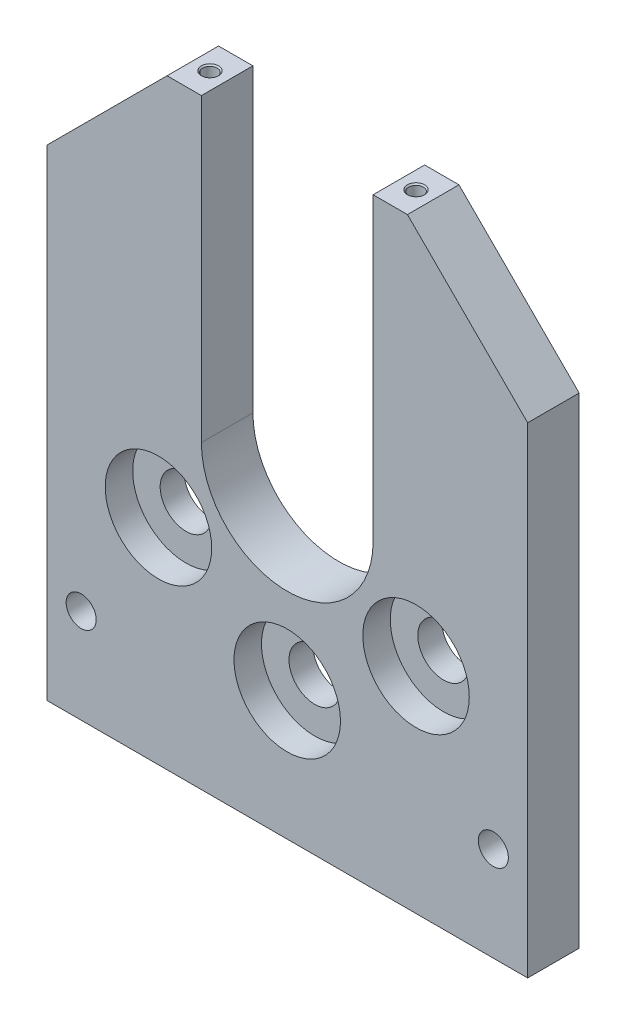
ISO-10303-21;
HEADER;
FILE_DESCRIPTION(('STEP AP214'),'2;1');
FILE_NAME('part.step','',(''),(''),'','','');
FILE_SCHEMA(('AUTOMOTIVE_DESIGN { 1 0 10303 214 1 1 1 1 }'));
ENDSEC;
DATA;
#1=APPLICATION_CONTEXT('core data for automotive mechanical design processes');
#2=APPLICATION_PROTOCOL_DEFINITION('international standard','automotive_design',2000,#1);
#3=PRODUCT_CONTEXT('',#1,'mechanical');
#4=PRODUCT('Part','Part','',(#3));
#5=PRODUCT_RELATED_PRODUCT_CATEGORY('part','',(#4));
#6=PRODUCT_DEFINITION_FORMATION('','',#4);
#7=PRODUCT_DEFINITION_CONTEXT('part definition',#1,'design');
#8=PRODUCT_DEFINITION('design','',#6,#7);
#9=PRODUCT_DEFINITION_SHAPE('','',#8);
#10=(LENGTH_UNIT() NAMED_UNIT(*) SI_UNIT(.MILLI.,.METRE.));
#11=(NAMED_UNIT(*) PLANE_ANGLE_UNIT() SI_UNIT($,.RADIAN.));
#12=(NAMED_UNIT(*) SI_UNIT($,.STERADIAN.) SOLID_ANGLE_UNIT());
#13=UNCERTAINTY_MEASURE_WITH_UNIT(LENGTH_MEASURE(1.E-05),#10,'distance_accuracy_value','');
#14=(GEOMETRIC_REPRESENTATION_CONTEXT(3) GLOBAL_UNCERTAINTY_ASSIGNED_CONTEXT((#13)) GLOBAL_UNIT_ASSIGNED_CONTEXT((#10,
#11,#12)) REPRESENTATION_CONTEXT('',''));
#15=CARTESIAN_POINT('',(0.,0.,0.));
#16=DIRECTION('',(0.,0.,1.));
#17=DIRECTION('',(1.,0.,0.));
#18=AXIS2_PLACEMENT_3D('',#15,#16,#17);
#19=CARTESIAN_POINT('',(0.,75.,-335.));
#20=DIRECTION('',(0.,0.,1.));
#21=DIRECTION('',(1.,0.,0.));
#22=AXIS2_PLACEMENT_3D('',#19,#20,#21);
#23=CYLINDRICAL_SURFACE('',#22,15.);
#24=CARTESIAN_POINT('',(0.,75.,-15.));
#25=DIRECTION('',(0.,0.,1.));
#26=DIRECTION('',(1.,0.,0.));
#27=AXIS2_PLACEMENT_3D('',#24,#25,#26);
#28=CIRCLE('',#27,15.);
#29=CARTESIAN_POINT('',(15.,75.,-15.));
#30=VERTEX_POINT('',#29);
#31=EDGE_CURVE('E228',#30,#30,#28,.T.);
#32=ORIENTED_EDGE('',*,*,#31,.F.);
#33=EDGE_LOOP('',(#32));
#34=FACE_BOUND('',#33,.T.);
#35=CARTESIAN_POINT('',(0.,75.,-1.));
#36=DIRECTION('',(0.,0.,1.));
#37=DIRECTION('',(1.,0.,0.));
#38=AXIS2_PLACEMENT_3D('',#35,#36,#37);
#39=CIRCLE('',#38,15.);
#40=CARTESIAN_POINT('',(15.,75.,-1.));
#41=VERTEX_POINT('',#40);
#42=EDGE_CURVE('E50',#41,#41,#39,.F.);
#43=ORIENTED_EDGE('',*,*,#42,.F.);
#44=EDGE_LOOP('',(#43));
#45=FACE_BOUND('',#44,.T.);
#46=ADVANCED_FACE('F45',(#34,#45),#23,.F.);
#47=CARTESIAN_POINT('',(75.,124.749371855331,-335.));
#48=DIRECTION('',(0.,0.,1.));
#49=DIRECTION('',(1.,0.,0.));
#50=AXIS2_PLACEMENT_3D('',#47,#48,#49);
#51=CYLINDRICAL_SURFACE('',#50,15.);
#52=CARTESIAN_POINT('',(75.,124.749371855331,-15.));
#53=DIRECTION('',(0.,0.,1.));
#54=DIRECTION('',(1.,0.,0.));
#55=AXIS2_PLACEMENT_3D('',#52,#53,#54);
#56=CIRCLE('',#55,15.);
#57=CARTESIAN_POINT('',(90.,124.749371855331,-15.));
#58=VERTEX_POINT('',#57);
#59=EDGE_CURVE('E232',#58,#58,#56,.T.);
#60=ORIENTED_EDGE('',*,*,#59,.F.);
#61=EDGE_LOOP('',(#60));
#62=FACE_BOUND('',#61,.T.);
#63=CARTESIAN_POINT('',(75.,124.749371855331,-1.));
#64=DIRECTION('',(0.,0.,1.));
#65=DIRECTION('',(1.,0.,0.));
#66=AXIS2_PLACEMENT_3D('',#63,#64,#65);
#67=CIRCLE('',#66,15.);
#68=CARTESIAN_POINT('',(90.,124.749371855331,-1.));
#69=VERTEX_POINT('',#68);
#70=EDGE_CURVE('E222',#69,#69,#67,.F.);
#71=ORIENTED_EDGE('',*,*,#70,.F.);
#72=EDGE_LOOP('',(#71));
#73=FACE_BOUND('',#72,.T.);
#74=ADVANCED_FACE('F315',(#62,#73),#51,.F.);
#75=CARTESIAN_POINT('',(-75.,124.749371855331,-335.));
#76=DIRECTION('',(0.,0.,1.));
#77=DIRECTION('',(1.,0.,0.));
#78=AXIS2_PLACEMENT_3D('',#75,#76,#77);
#79=CYLINDRICAL_SURFACE('',#78,15.);
#80=CARTESIAN_POINT('',(-75.,124.749371855331,-15.));
#81=DIRECTION('',(0.,0.,1.));
#82=DIRECTION('',(1.,0.,0.));
#83=AXIS2_PLACEMENT_3D('',#80,#81,#82);
#84=CIRCLE('',#83,15.);
#85=CARTESIAN_POINT('',(-60.,124.749371855331,-15.));
#86=VERTEX_POINT('',#85);
#87=EDGE_CURVE('E237',#86,#86,#84,.T.);
#88=ORIENTED_EDGE('',*,*,#87,.F.);
#89=EDGE_LOOP('',(#88));
#90=FACE_BOUND('',#89,.T.);
#91=CARTESIAN_POINT('',(-75.,124.749371855331,-1.));
#92=DIRECTION('',(0.,0.,1.));
#93=DIRECTION('',(1.,0.,0.));
#94=AXIS2_PLACEMENT_3D('',#91,#92,#93);
#95=CIRCLE('',#94,15.);
#96=CARTESIAN_POINT('',(-60.,124.749371855331,-1.));
#97=VERTEX_POINT('',#96);
#98=EDGE_CURVE('E220',#97,#97,#95,.F.);
#99=ORIENTED_EDGE('',*,*,#98,.F.);
#100=EDGE_LOOP('',(#99));
#101=FACE_BOUND('',#100,.T.);
#102=ADVANCED_FACE('F321',(#90,#101),#79,.F.);
#103=CARTESIAN_POINT('',(0.,350.,0.));
#104=DIRECTION('',(0.,1.,0.));
#105=DIRECTION('',(0.,0.,1.));
#106=AXIS2_PLACEMENT_3D('',#103,#104,#105);
#107=PLANE('',#106);
#108=CARTESIAN_POINT('',(60.,350.,0.));
#109=DIRECTION('',(0.,1.,0.));
#110=DIRECTION('',(0.,0.,1.));
#111=AXIS2_PLACEMENT_3D('',#108,#109,#110);
#112=CIRCLE('',#111,5.025);
#113=CARTESIAN_POINT('',(60.,350.,5.025));
#114=VERTEX_POINT('',#113);
#115=EDGE_CURVE('E138',#114,#114,#112,.T.);
#116=ORIENTED_EDGE('',*,*,#115,.F.);
#117=EDGE_LOOP('',(#116));
#118=FACE_BOUND('',#117,.T.);
#119=DIRECTION('',(1.,0.,0.));
#120=VECTOR('',#119,1.);
#121=CARTESIAN_POINT('',(-140.,350.,15.));
#122=LINE('',#121,#120);
#123=CARTESIAN_POINT('',(50.,350.,15.));
#124=VERTEX_POINT('',#123);
#125=CARTESIAN_POINT('',(70.,350.,15.));
#126=VERTEX_POINT('',#125);
#127=EDGE_CURVE('E178',#124,#126,#122,.T.);
#128=ORIENTED_EDGE('',*,*,#127,.T.);
#129=DIRECTION('',(0.,0.,-1.));
#130=VECTOR('',#129,1.);
#131=CARTESIAN_POINT('',(70.,350.,-15.));
#132=LINE('',#131,#130);
#133=CARTESIAN_POINT('',(70.,350.,-15.));
#134=VERTEX_POINT('',#133);
#135=EDGE_CURVE('E55',#126,#134,#132,.T.);
#136=ORIENTED_EDGE('',*,*,#135,.T.);
#137=DIRECTION('',(-1.,0.,0.));
#138=VECTOR('',#137,1.);
#139=CARTESIAN_POINT('',(-140.,350.,-15.));
#140=LINE('',#139,#138);
#141=CARTESIAN_POINT('',(50.,350.,-15.));
#142=VERTEX_POINT('',#141);
#143=EDGE_CURVE('E176',#134,#142,#140,.T.);
#144=ORIENTED_EDGE('',*,*,#143,.T.);
#145=DIRECTION('',(0.,0.,-1.));
#146=VECTOR('',#145,1.);
#147=CARTESIAN_POINT('',(50.,350.,0.));
#148=LINE('',#147,#146);
#149=EDGE_CURVE('E204',#124,#142,#148,.T.);
#150=ORIENTED_EDGE('',*,*,#149,.F.);
#151=EDGE_LOOP('',(#128,#136,#144,#150));
#152=FACE_BOUND('',#151,.T.);
#153=ADVANCED_FACE('F267',(#118,#152),#107,.T.);
#154=CARTESIAN_POINT('',(140.,350.,-15.));
#155=DIRECTION('',(-1.,0.,0.));
#156=DIRECTION('',(0.,0.,1.));
#157=AXIS2_PLACEMENT_3D('',#154,#155,#156);
#158=PLANE('',#157);
#159=DIRECTION('',(0.,-1.,0.));
#160=VECTOR('',#159,1.);
#161=CARTESIAN_POINT('',(140.,350.,-15.));
#162=LINE('',#161,#160);
#163=CARTESIAN_POINT('',(140.,280.,-15.));
#164=VERTEX_POINT('',#163);
#165=CARTESIAN_POINT('',(140.,0.,-15.));
#166=VERTEX_POINT('',#165);
#167=EDGE_CURVE('E199',#164,#166,#162,.T.);
#168=ORIENTED_EDGE('',*,*,#167,.F.);
#169=DIRECTION('',(0.,0.,1.));
#170=VECTOR('',#169,1.);
#171=CARTESIAN_POINT('',(140.,280.,15.));
#172=LINE('',#171,#170);
#173=CARTESIAN_POINT('',(140.,280.,15.));
#174=VERTEX_POINT('',#173);
#175=EDGE_CURVE('E11',#164,#174,#172,.T.);
#176=ORIENTED_EDGE('',*,*,#175,.T.);
#177=DIRECTION('',(0.,-1.,0.));
#178=VECTOR('',#177,1.);
#179=CARTESIAN_POINT('',(140.,350.,15.));
#180=LINE('',#179,#178);
#181=CARTESIAN_POINT('',(140.,0.,15.));
#182=VERTEX_POINT('',#181);
#183=EDGE_CURVE('E182',#174,#182,#180,.T.);
#184=ORIENTED_EDGE('',*,*,#183,.T.);
#185=DIRECTION('',(0.,0.,-1.));
#186=VECTOR('',#185,1.);
#187=CARTESIAN_POINT('',(140.,0.,-15.));
#188=LINE('',#187,#186);
#189=EDGE_CURVE('E175',#182,#166,#188,.T.);
#190=ORIENTED_EDGE('',*,*,#189,.T.);
#191=EDGE_LOOP('',(#168,#176,#184,#190));
#192=FACE_BOUND('',#191,.T.);
#193=ADVANCED_FACE('F366',(#192),#158,.F.);
#194=CARTESIAN_POINT('',(-140.,350.,-15.));
#195=DIRECTION('',(0.,0.,1.));
#196=DIRECTION('',(1.,0.,0.));
#197=AXIS2_PLACEMENT_3D('',#194,#195,#196);
#198=PLANE('',#197);
#199=ORIENTED_EDGE('',*,*,#87,.T.);
#200=EDGE_LOOP('',(#199));
#201=FACE_BOUND('',#200,.T.);
#202=ORIENTED_EDGE('',*,*,#59,.T.);
#203=EDGE_LOOP('',(#202));
#204=FACE_BOUND('',#203,.T.);
#205=ORIENTED_EDGE('',*,*,#31,.T.);
#206=EDGE_LOOP('',(#205));
#207=FACE_BOUND('',#206,.T.);
#208=CARTESIAN_POINT('',(-120.,55.,-15.));
#209=DIRECTION('',(0.,0.,1.));
#210=DIRECTION('',(1.,0.,0.));
#211=AXIS2_PLACEMENT_3D('',#208,#209,#210);
#212=CIRCLE('',#211,8.75000000000001);
#213=CARTESIAN_POINT('',(-111.25,55.,-15.));
#214=VERTEX_POINT('',#213);
#215=EDGE_CURVE('E254',#214,#214,#212,.T.);
#216=ORIENTED_EDGE('',*,*,#215,.T.);
#217=EDGE_LOOP('',(#216));
#218=FACE_BOUND('',#217,.T.);
#219=CARTESIAN_POINT('',(120.,55.,-15.));
#220=DIRECTION('',(0.,0.,1.));
#221=DIRECTION('',(1.,0.,0.));
#222=AXIS2_PLACEMENT_3D('',#219,#220,#221);
#223=CIRCLE('',#222,8.75);
#224=CARTESIAN_POINT('',(128.75,55.,-15.));
#225=VERTEX_POINT('',#224);
#226=EDGE_CURVE('E249',#225,#225,#223,.T.);
#227=ORIENTED_EDGE('',*,*,#226,.T.);
#228=EDGE_LOOP('',(#227));
#229=FACE_BOUND('',#228,.T.);
#230=DIRECTION('',(0.,-1.,0.));
#231=VECTOR('',#230,1.);
#232=CARTESIAN_POINT('',(-140.,350.,-15.));
#233=LINE('',#232,#231);
#234=CARTESIAN_POINT('',(-140.,280.,-15.));
#235=VERTEX_POINT('',#234);
#236=CARTESIAN_POINT('',(-140.,0.,-15.));
#237=VERTEX_POINT('',#236);
#238=EDGE_CURVE('E197',#235,#237,#233,.T.);
#239=ORIENTED_EDGE('',*,*,#238,.F.);
#240=DIRECTION('',(0.707106781186546,0.707106781186549,0.));
#241=VECTOR('',#240,1.);
#242=CARTESIAN_POINT('',(-70.0000000000001,350.,-15.));
#243=LINE('',#242,#241);
#244=CARTESIAN_POINT('',(-70.0000000000001,350.,-15.));
#245=VERTEX_POINT('',#244);
#246=EDGE_CURVE('E217',#235,#245,#243,.T.);
#247=ORIENTED_EDGE('',*,*,#246,.T.);
#248=CARTESIAN_POINT('',(-50.,350.,-15.));
#249=VERTEX_POINT('',#248);
#250=EDGE_CURVE('E179',#249,#245,#140,.T.);
#251=ORIENTED_EDGE('',*,*,#250,.F.);
#252=DIRECTION('',(0.,-1.,0.));
#253=VECTOR('',#252,1.);
#254=CARTESIAN_POINT('',(-50.,350.,-15.));
#255=LINE('',#254,#253);
#256=CARTESIAN_POINT('',(-50.,175.,-15.));
#257=VERTEX_POINT('',#256);
#258=EDGE_CURVE('E165',#249,#257,#255,.T.);
#259=ORIENTED_EDGE('',*,*,#258,.T.);
#260=CARTESIAN_POINT('',(0.,175.,-15.));
#261=DIRECTION('',(0.,0.,1.));
#262=DIRECTION('',(1.,0.,0.));
#263=AXIS2_PLACEMENT_3D('',#260,#261,#262);
#264=CIRCLE('',#263,50.);
#265=CARTESIAN_POINT('',(50.,175.,-15.));
#266=VERTEX_POINT('',#265);
#267=EDGE_CURVE('E172',#257,#266,#264,.T.);
#268=ORIENTED_EDGE('',*,*,#267,.T.);
#269=DIRECTION('',(0.,1.,0.));
#270=VECTOR('',#269,1.);
#271=CARTESIAN_POINT('',(50.,350.,-15.));
#272=LINE('',#271,#270);
#273=EDGE_CURVE('E169',#266,#142,#272,.T.);
#274=ORIENTED_EDGE('',*,*,#273,.T.);
#275=ORIENTED_EDGE('',*,*,#143,.F.);
#276=DIRECTION('',(0.707106781186546,-0.707106781186549,0.));
#277=VECTOR('',#276,1.);
#278=CARTESIAN_POINT('',(70.,350.,-15.));
#279=LINE('',#278,#277);
#280=EDGE_CURVE('E63',#134,#164,#279,.T.);
#281=ORIENTED_EDGE('',*,*,#280,.T.);
#282=ORIENTED_EDGE('',*,*,#167,.T.);
#283=DIRECTION('',(-1.,0.,0.));
#284=VECTOR('',#283,1.);
#285=CARTESIAN_POINT('',(-140.,0.,-15.));
#286=LINE('',#285,#284);
#287=EDGE_CURVE('E185',#166,#237,#286,.T.);
#288=ORIENTED_EDGE('',*,*,#287,.T.);
#289=EDGE_LOOP('',(#239,#247,#251,#259,#268,#274,#275,#281,#282,#288));
#290=FACE_BOUND('',#289,.T.);
#291=ADVANCED_FACE('F295',(#201,#204,#207,#218,#229,#290),#198,.F.);
#292=CARTESIAN_POINT('',(-140.,350.,-15.));
#293=DIRECTION('',(1.,0.,0.));
#294=DIRECTION('',(0.,0.,-1.));
#295=AXIS2_PLACEMENT_3D('',#292,#293,#294);
#296=PLANE('',#295);
#297=DIRECTION('',(0.,-1.,0.));
#298=VECTOR('',#297,1.);
#299=CARTESIAN_POINT('',(-140.,350.,15.));
#300=LINE('',#299,#298);
#301=CARTESIAN_POINT('',(-140.,280.,15.));
#302=VERTEX_POINT('',#301);
#303=CARTESIAN_POINT('',(-140.,0.,15.));
#304=VERTEX_POINT('',#303);
#305=EDGE_CURVE('E195',#302,#304,#300,.T.);
#306=ORIENTED_EDGE('',*,*,#305,.F.);
#307=DIRECTION('',(0.,0.,-1.));
#308=VECTOR('',#307,1.);
#309=CARTESIAN_POINT('',(-140.,280.,-15.));
#310=LINE('',#309,#308);
#311=EDGE_CURVE('E214',#302,#235,#310,.T.);
#312=ORIENTED_EDGE('',*,*,#311,.T.);
#313=ORIENTED_EDGE('',*,*,#238,.T.);
#314=DIRECTION('',(0.,0.,1.));
#315=VECTOR('',#314,1.);
#316=CARTESIAN_POINT('',(-140.,0.,-15.));
#317=LINE('',#316,#315);
#318=EDGE_CURVE('E188',#237,#304,#317,.T.);
#319=ORIENTED_EDGE('',*,*,#318,.T.);
#320=EDGE_LOOP('',(#306,#312,#313,#319));
#321=FACE_BOUND('',#320,.T.);
#322=ADVANCED_FACE('F281',(#321),#296,.F.);
#323=CARTESIAN_POINT('',(-140.,350.,15.));
#324=DIRECTION('',(0.,0.,-1.));
#325=DIRECTION('',(-1.,0.,0.));
#326=AXIS2_PLACEMENT_3D('',#323,#324,#325);
#327=PLANE('',#326);
#328=CARTESIAN_POINT('',(-75.,124.749371855331,15.));
#329=DIRECTION('',(0.,0.,1.));
#330=DIRECTION('',(1.,0.,0.));
#331=AXIS2_PLACEMENT_3D('',#328,#329,#330);
#332=CIRCLE('',#331,31.);
#333=CARTESIAN_POINT('',(-44.,124.749371855331,15.));
#334=VERTEX_POINT('',#333);
#335=EDGE_CURVE('E417',#334,#334,#332,.T.);
#336=ORIENTED_EDGE('',*,*,#335,.F.);
#337=EDGE_LOOP('',(#336));
#338=FACE_BOUND('',#337,.T.);
#339=CARTESIAN_POINT('',(0.,75.,15.));
#340=DIRECTION('',(0.,0.,1.));
#341=DIRECTION('',(1.,0.,0.));
#342=AXIS2_PLACEMENT_3D('',#339,#340,#341);
#343=CIRCLE('',#342,31.);
#344=CARTESIAN_POINT('',(31.,75.,15.));
#345=VERTEX_POINT('',#344);
#346=EDGE_CURVE('E420',#345,#345,#343,.T.);
#347=ORIENTED_EDGE('',*,*,#346,.F.);
#348=EDGE_LOOP('',(#347));
#349=FACE_BOUND('',#348,.T.);
#350=CARTESIAN_POINT('',(75.,124.749371855331,15.));
#351=DIRECTION('',(0.,0.,1.));
#352=DIRECTION('',(1.,0.,0.));
#353=AXIS2_PLACEMENT_3D('',#350,#351,#352);
#354=CIRCLE('',#353,31.);
#355=CARTESIAN_POINT('',(106.,124.749371855331,15.));
#356=VERTEX_POINT('',#355);
#357=EDGE_CURVE('E427',#356,#356,#354,.T.);
#358=ORIENTED_EDGE('',*,*,#357,.F.);
#359=EDGE_LOOP('',(#358));
#360=FACE_BOUND('',#359,.T.);
#361=CARTESIAN_POINT('',(-120.,55.,15.));
#362=DIRECTION('',(0.,0.,1.));
#363=DIRECTION('',(1.,0.,0.));
#364=AXIS2_PLACEMENT_3D('',#361,#362,#363);
#365=CIRCLE('',#364,8.75000000000001);
#366=CARTESIAN_POINT('',(-111.25,55.,15.));
#367=VERTEX_POINT('',#366);
#368=EDGE_CURVE('E246',#367,#367,#365,.T.);
#369=ORIENTED_EDGE('',*,*,#368,.F.);
#370=EDGE_LOOP('',(#369));
#371=FACE_BOUND('',#370,.T.);
#372=CARTESIAN_POINT('',(120.,55.,15.));
#373=DIRECTION('',(0.,0.,1.));
#374=DIRECTION('',(1.,0.,0.));
#375=AXIS2_PLACEMENT_3D('',#372,#373,#374);
#376=CIRCLE('',#375,8.75);
#377=CARTESIAN_POINT('',(128.75,55.,15.));
#378=VERTEX_POINT('',#377);
#379=EDGE_CURVE('E245',#378,#378,#376,.T.);
#380=ORIENTED_EDGE('',*,*,#379,.F.);
#381=EDGE_LOOP('',(#380));
#382=FACE_BOUND('',#381,.T.);
#383=CARTESIAN_POINT('',(-70.0000000000001,350.,15.));
#384=VERTEX_POINT('',#383);
#385=CARTESIAN_POINT('',(-50.,350.,15.));
#386=VERTEX_POINT('',#385);
#387=EDGE_CURVE('E180',#384,#386,#122,.T.);
#388=ORIENTED_EDGE('',*,*,#387,.F.);
#389=DIRECTION('',(-0.707106781186546,-0.707106781186549,0.));
#390=VECTOR('',#389,1.);
#391=CARTESIAN_POINT('',(-70.0000000000001,350.,15.));
#392=LINE('',#391,#390);
#393=EDGE_CURVE('E212',#384,#302,#392,.T.);
#394=ORIENTED_EDGE('',*,*,#393,.T.);
#395=ORIENTED_EDGE('',*,*,#305,.T.);
#396=DIRECTION('',(1.,0.,0.));
#397=VECTOR('',#396,1.);
#398=CARTESIAN_POINT('',(-140.,0.,15.));
#399=LINE('',#398,#397);
#400=EDGE_CURVE('E191',#304,#182,#399,.T.);
#401=ORIENTED_EDGE('',*,*,#400,.T.);
#402=ORIENTED_EDGE('',*,*,#183,.F.);
#403=DIRECTION('',(-0.707106781186546,0.707106781186549,0.));
#404=VECTOR('',#403,1.);
#405=CARTESIAN_POINT('',(70.,350.,15.));
#406=LINE('',#405,#404);
#407=EDGE_CURVE('E210',#174,#126,#406,.T.);
#408=ORIENTED_EDGE('',*,*,#407,.T.);
#409=ORIENTED_EDGE('',*,*,#127,.F.);
#410=DIRECTION('',(0.,1.,0.));
#411=VECTOR('',#410,1.);
#412=CARTESIAN_POINT('',(50.,350.,15.));
#413=LINE('',#412,#411);
#414=CARTESIAN_POINT('',(50.,175.,15.));
#415=VERTEX_POINT('',#414);
#416=EDGE_CURVE('E160',#415,#124,#413,.T.);
#417=ORIENTED_EDGE('',*,*,#416,.F.);
#418=CARTESIAN_POINT('',(0.,175.,15.));
#419=DIRECTION('',(0.,0.,1.));
#420=DIRECTION('',(1.,0.,0.));
#421=AXIS2_PLACEMENT_3D('',#418,#419,#420);
#422=CIRCLE('',#421,50.);
#423=CARTESIAN_POINT('',(-50.,175.,15.));
#424=VERTEX_POINT('',#423);
#425=EDGE_CURVE('E157',#424,#415,#422,.T.);
#426=ORIENTED_EDGE('',*,*,#425,.F.);
#427=DIRECTION('',(0.,-1.,0.));
#428=VECTOR('',#427,1.);
#429=CARTESIAN_POINT('',(-50.,350.,15.));
#430=LINE('',#429,#428);
#431=EDGE_CURVE('E154',#386,#424,#430,.T.);
#432=ORIENTED_EDGE('',*,*,#431,.F.);
#433=EDGE_LOOP('',(#388,#394,#395,#401,#402,#408,#409,#417,#426,#432));
#434=FACE_BOUND('',#433,.T.);
#435=ADVANCED_FACE('F265',(#338,#349,#360,#371,#382,#434),#327,.F.);
#436=CARTESIAN_POINT('',(-60.,350.,0.));
#437=DIRECTION('',(0.,1.,0.));
#438=DIRECTION('',(0.,0.,1.));
#439=AXIS2_PLACEMENT_3D('',#436,#437,#438);
#440=CIRCLE('',#439,5.025);
#441=CARTESIAN_POINT('',(-60.,350.,5.025));
#442=VERTEX_POINT('',#441);
#443=EDGE_CURVE('E145',#442,#442,#440,.T.);
#444=ORIENTED_EDGE('',*,*,#443,.F.);
#445=EDGE_LOOP('',(#444));
#446=FACE_BOUND('',#445,.T.);
#447=ORIENTED_EDGE('',*,*,#250,.T.);
#448=DIRECTION('',(0.,0.,1.));
#449=VECTOR('',#448,1.);
#450=CARTESIAN_POINT('',(-70.0000000000001,350.,15.));
#451=LINE('',#450,#449);
#452=EDGE_CURVE('E207',#245,#384,#451,.T.);
#453=ORIENTED_EDGE('',*,*,#452,.T.);
#454=ORIENTED_EDGE('',*,*,#387,.T.);
#455=DIRECTION('',(0.,0.,1.));
#456=VECTOR('',#455,1.);
#457=CARTESIAN_POINT('',(-50.,350.,0.));
#458=LINE('',#457,#456);
#459=EDGE_CURVE('E201',#249,#386,#458,.T.);
#460=ORIENTED_EDGE('',*,*,#459,.F.);
#461=EDGE_LOOP('',(#447,#453,#454,#460));
#462=FACE_BOUND('',#461,.T.);
#463=ADVANCED_FACE('F261',(#446,#462),#107,.T.);
#464=CARTESIAN_POINT('',(0.,0.,0.));
#465=DIRECTION('',(0.,1.,0.));
#466=DIRECTION('',(0.,0.,1.));
#467=AXIS2_PLACEMENT_3D('',#464,#465,#466);
#468=PLANE('',#467);
#469=ORIENTED_EDGE('',*,*,#189,.F.);
#470=ORIENTED_EDGE('',*,*,#400,.F.);
#471=ORIENTED_EDGE('',*,*,#318,.F.);
#472=ORIENTED_EDGE('',*,*,#287,.F.);
#473=EDGE_LOOP('',(#469,#470,#471,#472));
#474=FACE_BOUND('',#473,.T.);
#475=ADVANCED_FACE('F264',(#474),#468,.F.);
#476=CARTESIAN_POINT('',(0.,175.,-335.));
#477=DIRECTION('',(0.,0.,1.));
#478=DIRECTION('',(1.,0.,0.));
#479=AXIS2_PLACEMENT_3D('',#476,#477,#478);
#480=CYLINDRICAL_SURFACE('',#479,50.);
#481=DIRECTION('',(0.,0.,1.));
#482=VECTOR('',#481,1.);
#483=CARTESIAN_POINT('',(-50.,175.,-335.));
#484=LINE('',#483,#482);
#485=EDGE_CURVE('E162',#257,#424,#484,.T.);
#486=ORIENTED_EDGE('',*,*,#485,.T.);
#487=ORIENTED_EDGE('',*,*,#425,.T.);
#488=DIRECTION('',(0.,0.,1.));
#489=VECTOR('',#488,1.);
#490=CARTESIAN_POINT('',(50.,175.,-335.));
#491=LINE('',#490,#489);
#492=EDGE_CURVE('E163',#266,#415,#491,.T.);
#493=ORIENTED_EDGE('',*,*,#492,.F.);
#494=ORIENTED_EDGE('',*,*,#267,.F.);
#495=EDGE_LOOP('',(#486,#487,#493,#494));
#496=FACE_BOUND('',#495,.T.);
#497=ADVANCED_FACE('F300',(#496),#480,.F.);
#498=CARTESIAN_POINT('',(50.,350.,-335.));
#499=DIRECTION('',(1.,0.,0.));
#500=DIRECTION('',(0.,1.,0.));
#501=AXIS2_PLACEMENT_3D('',#498,#499,#500);
#502=PLANE('',#501);
#503=ORIENTED_EDGE('',*,*,#492,.T.);
#504=ORIENTED_EDGE('',*,*,#416,.T.);
#505=ORIENTED_EDGE('',*,*,#149,.T.);
#506=ORIENTED_EDGE('',*,*,#273,.F.);
#507=EDGE_LOOP('',(#503,#504,#505,#506));
#508=FACE_BOUND('',#507,.T.);
#509=ADVANCED_FACE('F298',(#508),#502,.F.);
#510=CARTESIAN_POINT('',(-50.,350.,-335.));
#511=DIRECTION('',(-1.,0.,0.));
#512=DIRECTION('',(0.,-1.,0.));
#513=AXIS2_PLACEMENT_3D('',#510,#511,#512);
#514=PLANE('',#513);
#515=ORIENTED_EDGE('',*,*,#459,.T.);
#516=ORIENTED_EDGE('',*,*,#431,.T.);
#517=ORIENTED_EDGE('',*,*,#485,.F.);
#518=ORIENTED_EDGE('',*,*,#258,.F.);
#519=EDGE_LOOP('',(#515,#516,#517,#518));
#520=FACE_BOUND('',#519,.T.);
#521=ADVANCED_FACE('F305',(#520),#514,.F.);
#522=CARTESIAN_POINT('',(-70.0000000000001,350.,0.));
#523=DIRECTION('',(-0.707106781186549,0.707106781186546,0.));
#524=DIRECTION('',(0.,0.,-1.));
#525=AXIS2_PLACEMENT_3D('',#522,#523,#524);
#526=PLANE('',#525);
#527=ORIENTED_EDGE('',*,*,#246,.F.);
#528=ORIENTED_EDGE('',*,*,#311,.F.);
#529=ORIENTED_EDGE('',*,*,#393,.F.);
#530=ORIENTED_EDGE('',*,*,#452,.F.);
#531=EDGE_LOOP('',(#527,#528,#529,#530));
#532=FACE_BOUND('',#531,.T.);
#533=ADVANCED_FACE('F275',(#532),#526,.T.);
#534=CARTESIAN_POINT('',(70.,350.,0.));
#535=DIRECTION('',(0.707106781186549,0.707106781186546,0.));
#536=DIRECTION('',(0.,0.,1.));
#537=AXIS2_PLACEMENT_3D('',#534,#535,#536);
#538=PLANE('',#537);
#539=ORIENTED_EDGE('',*,*,#407,.F.);
#540=ORIENTED_EDGE('',*,*,#175,.F.);
#541=ORIENTED_EDGE('',*,*,#280,.F.);
#542=ORIENTED_EDGE('',*,*,#135,.F.);
#543=EDGE_LOOP('',(#539,#540,#541,#542));
#544=FACE_BOUND('',#543,.T.);
#545=ADVANCED_FACE('F48',(#544),#538,.T.);
#546=CARTESIAN_POINT('',(60.,325.5,0.));
#547=DIRECTION('',(0.,1.,0.));
#548=DIRECTION('',(0.,0.,1.));
#549=AXIS2_PLACEMENT_3D('',#546,#547,#548);
#550=CONICAL_SURFACE('',#549,4.24999999999999,1.02974425867664);
#551=CARTESIAN_POINT('',(60.,322.946342369133,0.));
#552=VERTEX_POINT('',#551);
#553=VERTEX_LOOP('',#552);
#554=FACE_BOUND('',#553,.T.);
#555=CARTESIAN_POINT('',(60.,325.5,0.));
#556=DIRECTION('',(0.,1.,0.));
#557=DIRECTION('',(0.,0.,1.));
#558=AXIS2_PLACEMENT_3D('',#555,#556,#557);
#559=CIRCLE('',#558,4.24999999999999);
#560=CARTESIAN_POINT('',(60.,325.5,4.24999999999999));
#561=VERTEX_POINT('',#560);
#562=EDGE_CURVE('E151',#561,#561,#559,.T.);
#563=ORIENTED_EDGE('',*,*,#562,.T.);
#564=EDGE_LOOP('',(#563));
#565=FACE_BOUND('',#564,.T.);
#566=ADVANCED_FACE('F347',(#554,#565),#550,.F.);
#567=CARTESIAN_POINT('',(60.,350.,0.));
#568=DIRECTION('',(0.,1.,0.));
#569=DIRECTION('',(0.,0.,1.));
#570=AXIS2_PLACEMENT_3D('',#567,#568,#569);
#571=CYLINDRICAL_SURFACE('',#570,4.24999999999999);
#572=ORIENTED_EDGE('',*,*,#562,.F.);
#573=EDGE_LOOP('',(#572));
#574=FACE_BOUND('',#573,.T.);
#575=CARTESIAN_POINT('',(60.,349.225,0.));
#576=DIRECTION('',(0.,1.,0.));
#577=DIRECTION('',(0.,0.,1.));
#578=AXIS2_PLACEMENT_3D('',#575,#576,#577);
#579=CIRCLE('',#578,4.24999999999999);
#580=CARTESIAN_POINT('',(60.,349.225,4.24999999999999));
#581=VERTEX_POINT('',#580);
#582=EDGE_CURVE('E142',#581,#581,#579,.T.);
#583=ORIENTED_EDGE('',*,*,#582,.T.);
#584=EDGE_LOOP('',(#583));
#585=FACE_BOUND('',#584,.T.);
#586=ADVANCED_FACE('F343',(#574,#585),#571,.F.);
#587=CARTESIAN_POINT('',(60.,350.,0.));
#588=DIRECTION('',(0.,1.,0.));
#589=DIRECTION('',(0.,0.,1.));
#590=AXIS2_PLACEMENT_3D('',#587,#588,#589);
#591=CONICAL_SURFACE('',#590,5.025,0.785398163397439);
#592=ORIENTED_EDGE('',*,*,#582,.F.);
#593=EDGE_LOOP('',(#592));
#594=FACE_BOUND('',#593,.T.);
#595=ORIENTED_EDGE('',*,*,#115,.T.);
#596=EDGE_LOOP('',(#595));
#597=FACE_BOUND('',#596,.T.);
#598=ADVANCED_FACE('F132',(#594,#597),#591,.F.);
#599=CARTESIAN_POINT('',(-60.,325.5,0.));
#600=DIRECTION('',(0.,1.,0.));
#601=DIRECTION('',(0.,0.,1.));
#602=AXIS2_PLACEMENT_3D('',#599,#600,#601);
#603=CONICAL_SURFACE('',#602,4.24999999999999,1.02974425867664);
#604=CARTESIAN_POINT('',(-60.,322.946342369133,0.));
#605=VERTEX_POINT('',#604);
#606=VERTEX_LOOP('',#605);
#607=FACE_BOUND('',#606,.T.);
#608=CARTESIAN_POINT('',(-60.,325.5,0.));
#609=DIRECTION('',(0.,1.,0.));
#610=DIRECTION('',(0.,0.,1.));
#611=AXIS2_PLACEMENT_3D('',#608,#609,#610);
#612=CIRCLE('',#611,4.24999999999999);
#613=CARTESIAN_POINT('',(-60.,325.5,4.24999999999999));
#614=VERTEX_POINT('',#613);
#615=EDGE_CURVE('E136',#614,#614,#612,.T.);
#616=ORIENTED_EDGE('',*,*,#615,.T.);
#617=EDGE_LOOP('',(#616));
#618=FACE_BOUND('',#617,.T.);
#619=ADVANCED_FACE('F128',(#607,#618),#603,.F.);
#620=CARTESIAN_POINT('',(-60.,350.,0.));
#621=DIRECTION('',(0.,1.,0.));
#622=DIRECTION('',(0.,0.,1.));
#623=AXIS2_PLACEMENT_3D('',#620,#621,#622);
#624=CYLINDRICAL_SURFACE('',#623,4.24999999999999);
#625=ORIENTED_EDGE('',*,*,#615,.F.);
#626=EDGE_LOOP('',(#625));
#627=FACE_BOUND('',#626,.T.);
#628=CARTESIAN_POINT('',(-60.,349.225,0.));
#629=DIRECTION('',(0.,1.,0.));
#630=DIRECTION('',(0.,0.,1.));
#631=AXIS2_PLACEMENT_3D('',#628,#629,#630);
#632=CIRCLE('',#631,4.24999999999999);
#633=CARTESIAN_POINT('',(-60.,349.225,4.24999999999999));
#634=VERTEX_POINT('',#633);
#635=EDGE_CURVE('E139',#634,#634,#632,.T.);
#636=ORIENTED_EDGE('',*,*,#635,.T.);
#637=EDGE_LOOP('',(#636));
#638=FACE_BOUND('',#637,.T.);
#639=ADVANCED_FACE('F131',(#627,#638),#624,.F.);
#640=CARTESIAN_POINT('',(-60.,350.,0.));
#641=DIRECTION('',(0.,1.,0.));
#642=DIRECTION('',(0.,0.,1.));
#643=AXIS2_PLACEMENT_3D('',#640,#641,#642);
#644=CONICAL_SURFACE('',#643,5.025,0.785398163397439);
#645=ORIENTED_EDGE('',*,*,#635,.F.);
#646=EDGE_LOOP('',(#645));
#647=FACE_BOUND('',#646,.T.);
#648=ORIENTED_EDGE('',*,*,#443,.T.);
#649=EDGE_LOOP('',(#648));
#650=FACE_BOUND('',#649,.T.);
#651=ADVANCED_FACE('F259',(#647,#650),#644,.F.);
#652=CARTESIAN_POINT('',(120.,55.,-335.));
#653=DIRECTION('',(0.,0.,1.));
#654=DIRECTION('',(1.,0.,0.));
#655=AXIS2_PLACEMENT_3D('',#652,#653,#654);
#656=CYLINDRICAL_SURFACE('',#655,8.75);
#657=ORIENTED_EDGE('',*,*,#379,.T.);
#658=EDGE_LOOP('',(#657));
#659=FACE_BOUND('',#658,.T.);
#660=ORIENTED_EDGE('',*,*,#226,.F.);
#661=EDGE_LOOP('',(#660));
#662=FACE_BOUND('',#661,.T.);
#663=ADVANCED_FACE('F331',(#659,#662),#656,.F.);
#664=CARTESIAN_POINT('',(-120.,55.,-335.));
#665=DIRECTION('',(0.,0.,1.));
#666=DIRECTION('',(1.,0.,0.));
#667=AXIS2_PLACEMENT_3D('',#664,#665,#666);
#668=CYLINDRICAL_SURFACE('',#667,8.75000000000001);
#669=ORIENTED_EDGE('',*,*,#368,.T.);
#670=EDGE_LOOP('',(#669));
#671=FACE_BOUND('',#670,.T.);
#672=ORIENTED_EDGE('',*,*,#215,.F.);
#673=EDGE_LOOP('',(#672));
#674=FACE_BOUND('',#673,.T.);
#675=ADVANCED_FACE('F327',(#671,#674),#668,.F.);
#676=CARTESIAN_POINT('',(-75.,124.749371855331,-1.00000000000001));
#677=DIRECTION('',(0.,0.,1.));
#678=DIRECTION('',(1.,0.,0.));
#679=AXIS2_PLACEMENT_3D('',#676,#677,#678);
#680=PLANE('',#679);
#681=CARTESIAN_POINT('',(-75.,124.749371855331,-1.00000000000001));
#682=DIRECTION('',(0.,0.,1.));
#683=DIRECTION('',(1.,0.,0.));
#684=AXIS2_PLACEMENT_3D('',#681,#682,#683);
#685=CIRCLE('',#684,31.);
#686=CARTESIAN_POINT('',(-44.,124.749371855331,-1.00000000000001));
#687=VERTEX_POINT('',#686);
#688=EDGE_CURVE('E223',#687,#687,#685,.T.);
#689=ORIENTED_EDGE('',*,*,#688,.T.);
#690=EDGE_LOOP('',(#689));
#691=FACE_BOUND('',#690,.T.);
#692=ORIENTED_EDGE('',*,*,#98,.T.);
#693=EDGE_LOOP('',(#692));
#694=FACE_BOUND('',#693,.T.);
#695=ADVANCED_FACE('F330',(#691,#694),#680,.T.);
#696=CARTESIAN_POINT('',(-75.,124.749371855331,-1.00000000000001));
#697=DIRECTION('',(0.,0.,1.));
#698=DIRECTION('',(1.,0.,0.));
#699=AXIS2_PLACEMENT_3D('',#696,#697,#698);
#700=CYLINDRICAL_SURFACE('',#699,31.);
#701=ORIENTED_EDGE('',*,*,#688,.F.);
#702=EDGE_LOOP('',(#701));
#703=FACE_BOUND('',#702,.T.);
#704=ORIENTED_EDGE('',*,*,#335,.T.);
#705=EDGE_LOOP('',(#704));
#706=FACE_BOUND('',#705,.T.);
#707=ADVANCED_FACE('F393',(#703,#706),#700,.F.);
#708=CARTESIAN_POINT('',(75.,124.749371855331,-1.00000000000001));
#709=DIRECTION('',(0.,0.,1.));
#710=DIRECTION('',(1.,0.,0.));
#711=AXIS2_PLACEMENT_3D('',#708,#709,#710);
#712=PLANE('',#711);
#713=CARTESIAN_POINT('',(75.,124.749371855331,-1.00000000000001));
#714=DIRECTION('',(0.,0.,1.));
#715=DIRECTION('',(1.,0.,0.));
#716=AXIS2_PLACEMENT_3D('',#713,#714,#715);
#717=CIRCLE('',#716,31.);
#718=CARTESIAN_POINT('',(106.,124.749371855331,-1.00000000000001));
#719=VERTEX_POINT('',#718);
#720=EDGE_CURVE('E240',#719,#719,#717,.T.);
#721=ORIENTED_EDGE('',*,*,#720,.T.);
#722=EDGE_LOOP('',(#721));
#723=FACE_BOUND('',#722,.T.);
#724=ORIENTED_EDGE('',*,*,#70,.T.);
#725=EDGE_LOOP('',(#724));
#726=FACE_BOUND('',#725,.T.);
#727=ADVANCED_FACE('F389',(#723,#726),#712,.T.);
#728=CARTESIAN_POINT('',(75.,124.749371855331,-1.00000000000001));
#729=DIRECTION('',(0.,0.,1.));
#730=DIRECTION('',(1.,0.,0.));
#731=AXIS2_PLACEMENT_3D('',#728,#729,#730);
#732=CYLINDRICAL_SURFACE('',#731,31.);
#733=ORIENTED_EDGE('',*,*,#720,.F.);
#734=EDGE_LOOP('',(#733));
#735=FACE_BOUND('',#734,.T.);
#736=ORIENTED_EDGE('',*,*,#357,.T.);
#737=EDGE_LOOP('',(#736));
#738=FACE_BOUND('',#737,.T.);
#739=ADVANCED_FACE('F392',(#735,#738),#732,.F.);
#740=CARTESIAN_POINT('',(0.,75.,-1.00000000000001));
#741=DIRECTION('',(0.,0.,1.));
#742=DIRECTION('',(1.,0.,0.));
#743=AXIS2_PLACEMENT_3D('',#740,#741,#742);
#744=PLANE('',#743);
#745=CARTESIAN_POINT('',(0.,75.,-1.00000000000001));
#746=DIRECTION('',(0.,0.,1.));
#747=DIRECTION('',(1.,0.,0.));
#748=AXIS2_PLACEMENT_3D('',#745,#746,#747);
#749=CIRCLE('',#748,31.);
#750=CARTESIAN_POINT('',(31.,75.,-1.00000000000001));
#751=VERTEX_POINT('',#750);
#752=EDGE_CURVE('E425',#751,#751,#749,.T.);
#753=ORIENTED_EDGE('',*,*,#752,.T.);
#754=EDGE_LOOP('',(#753));
#755=FACE_BOUND('',#754,.T.);
#756=ORIENTED_EDGE('',*,*,#42,.T.);
#757=EDGE_LOOP('',(#756));
#758=FACE_BOUND('',#757,.T.);
#759=ADVANCED_FACE('F397',(#755,#758),#744,.T.);
#760=CARTESIAN_POINT('',(0.,75.,-1.00000000000001));
#761=DIRECTION('',(0.,0.,1.));
#762=DIRECTION('',(1.,0.,0.));
#763=AXIS2_PLACEMENT_3D('',#760,#761,#762);
#764=CYLINDRICAL_SURFACE('',#763,31.);
#765=ORIENTED_EDGE('',*,*,#752,.F.);
#766=EDGE_LOOP('',(#765));
#767=FACE_BOUND('',#766,.T.);
#768=ORIENTED_EDGE('',*,*,#346,.T.);
#769=EDGE_LOOP('',(#768));
#770=FACE_BOUND('',#769,.T.);
#771=ADVANCED_FACE('F401',(#767,#770),#764,.F.);
#772=CLOSED_SHELL('',(#46,#74,#102,#153,#193,#291,#322,#435,#463,#475,#497,#509,#521,#533,#545,
#566,#586,#598,#619,#639,#651,#663,#675,#695,#707,#727,#739,#759,#771));
#773=MANIFOLD_SOLID_BREP('B2',#772);
#774=ADVANCED_BREP_SHAPE_REPRESENTATION('',(#18,#773),#14);
#775=SHAPE_DEFINITION_REPRESENTATION(#9,#774);
ENDSEC;
END-ISO-10303-21;
